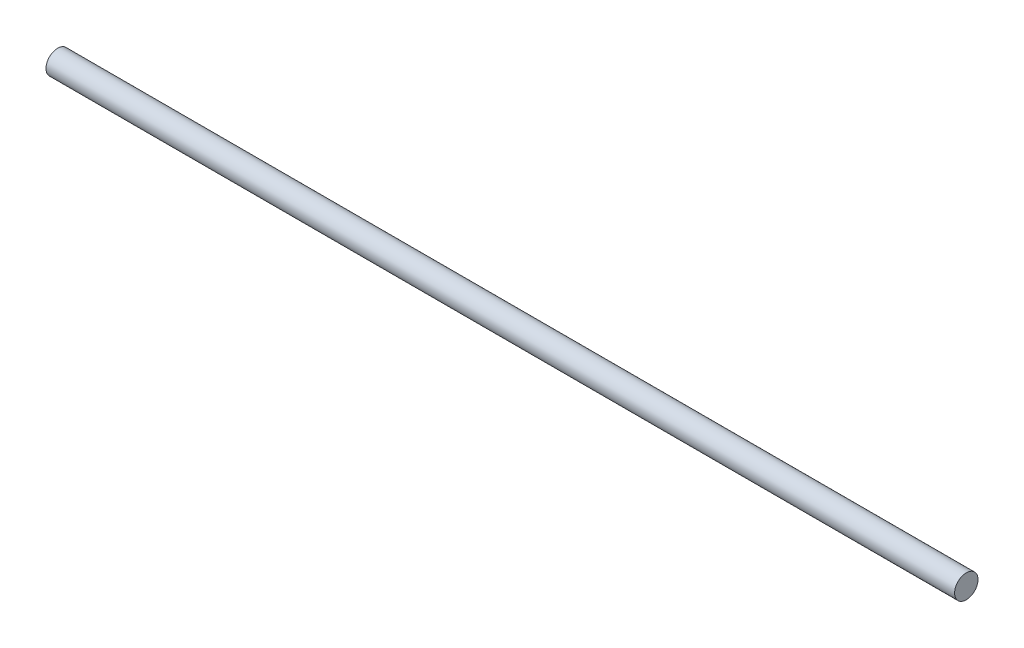
ISO-10303-21;
HEADER;
FILE_DESCRIPTION(('STEP AP214'),'2;1');
FILE_NAME('part.step','',(''),(''),'','','');
FILE_SCHEMA(('AUTOMOTIVE_DESIGN { 1 0 10303 214 1 1 1 1 }'));
ENDSEC;
DATA;
#1=APPLICATION_CONTEXT('core data for automotive mechanical design processes');
#2=APPLICATION_PROTOCOL_DEFINITION('international standard','automotive_design',2000,#1);
#3=PRODUCT_CONTEXT('',#1,'mechanical');
#4=PRODUCT('Part','Part','',(#3));
#5=PRODUCT_RELATED_PRODUCT_CATEGORY('part','',(#4));
#6=PRODUCT_DEFINITION_FORMATION('','',#4);
#7=PRODUCT_DEFINITION_CONTEXT('part definition',#1,'design');
#8=PRODUCT_DEFINITION('design','',#6,#7);
#9=PRODUCT_DEFINITION_SHAPE('','',#8);
#10=(LENGTH_UNIT() NAMED_UNIT(*) SI_UNIT(.MILLI.,.METRE.));
#11=(NAMED_UNIT(*) PLANE_ANGLE_UNIT() SI_UNIT($,.RADIAN.));
#12=(NAMED_UNIT(*) SI_UNIT($,.STERADIAN.) SOLID_ANGLE_UNIT());
#13=UNCERTAINTY_MEASURE_WITH_UNIT(LENGTH_MEASURE(1.E-05),#10,'distance_accuracy_value','');
#14=(GEOMETRIC_REPRESENTATION_CONTEXT(3) GLOBAL_UNCERTAINTY_ASSIGNED_CONTEXT((#13)) GLOBAL_UNIT_ASSIGNED_CONTEXT((#10,
#11,#12)) REPRESENTATION_CONTEXT('',''));
#15=CARTESIAN_POINT('',(0.,0.,0.));
#16=DIRECTION('',(0.,0.,1.));
#17=DIRECTION('',(1.,0.,0.));
#18=AXIS2_PLACEMENT_3D('',#15,#16,#17);
#19=CARTESIAN_POINT('',(4.,4.,0.));
#20=DIRECTION('',(1.,0.,0.));
#21=DIRECTION('',(0.,0.,-1.));
#22=AXIS2_PLACEMENT_3D('',#19,#20,#21);
#23=PLANE('',#22);
#24=CARTESIAN_POINT('',(4.,4.,0.));
#25=DIRECTION('',(1.,0.,0.));
#26=DIRECTION('',(0.,0.,-1.));
#27=AXIS2_PLACEMENT_3D('',#24,#25,#26);
#28=CIRCLE('',#27,2.5);
#29=CARTESIAN_POINT('',(4.,4.,-2.5));
#30=VERTEX_POINT('',#29);
#31=EDGE_CURVE('E39',#30,#30,#28,.T.);
#32=ORIENTED_EDGE('',*,*,#31,.F.);
#33=EDGE_LOOP('',(#32));
#34=FACE_BOUND('',#33,.T.);
#35=ADVANCED_FACE('F32',(#34),#23,.F.);
#36=CARTESIAN_POINT('',(198.,4.,0.));
#37=DIRECTION('',(1.,0.,0.));
#38=DIRECTION('',(0.,0.,-1.));
#39=AXIS2_PLACEMENT_3D('',#36,#37,#38);
#40=PLANE('',#39);
#41=CARTESIAN_POINT('',(198.,4.,0.));
#42=DIRECTION('',(1.,0.,0.));
#43=DIRECTION('',(0.,0.,-1.));
#44=AXIS2_PLACEMENT_3D('',#41,#42,#43);
#45=CIRCLE('',#44,2.5);
#46=CARTESIAN_POINT('',(198.,4.,-2.5));
#47=VERTEX_POINT('',#46);
#48=EDGE_CURVE('E11',#47,#47,#45,.T.);
#49=ORIENTED_EDGE('',*,*,#48,.T.);
#50=EDGE_LOOP('',(#49));
#51=FACE_BOUND('',#50,.T.);
#52=ADVANCED_FACE('F46',(#51),#40,.T.);
#53=CARTESIAN_POINT('',(4.,4.,0.));
#54=DIRECTION('',(1.,0.,0.));
#55=DIRECTION('',(0.,1.,0.));
#56=AXIS2_PLACEMENT_3D('',#53,#54,#55);
#57=CYLINDRICAL_SURFACE('',#56,2.5);
#58=ORIENTED_EDGE('',*,*,#48,.F.);
#59=EDGE_LOOP('',(#58));
#60=FACE_BOUND('',#59,.T.);
#61=ORIENTED_EDGE('',*,*,#31,.T.);
#62=EDGE_LOOP('',(#61));
#63=FACE_BOUND('',#62,.T.);
#64=ADVANCED_FACE('F48',(#60,#63),#57,.T.);
#65=CLOSED_SHELL('',(#35,#52,#64));
#66=MANIFOLD_SOLID_BREP('B2',#65);
#67=ADVANCED_BREP_SHAPE_REPRESENTATION('',(#18,#66),#14);
#68=SHAPE_DEFINITION_REPRESENTATION(#9,#67);
ENDSEC;
END-ISO-10303-21;
